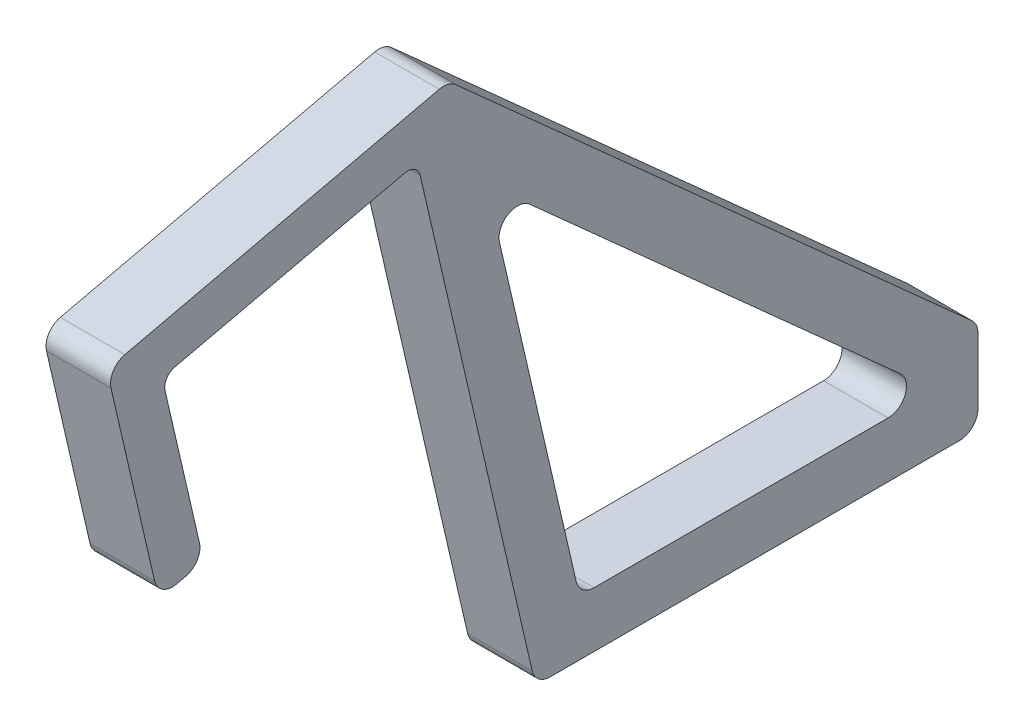
ISO-10303-21;
HEADER;
FILE_DESCRIPTION(('STEP AP214'),'2;1');
FILE_NAME('part.step','',(''),(''),'','','');
FILE_SCHEMA(('AUTOMOTIVE_DESIGN { 1 0 10303 214 1 1 1 1 }'));
ENDSEC;
DATA;
#1=APPLICATION_CONTEXT('core data for automotive mechanical design processes');
#2=APPLICATION_PROTOCOL_DEFINITION('international standard','automotive_design',2000,#1);
#3=PRODUCT_CONTEXT('',#1,'mechanical');
#4=PRODUCT('Part','Part','',(#3));
#5=PRODUCT_RELATED_PRODUCT_CATEGORY('part','',(#4));
#6=PRODUCT_DEFINITION_FORMATION('','',#4);
#7=PRODUCT_DEFINITION_CONTEXT('part definition',#1,'design');
#8=PRODUCT_DEFINITION('design','',#6,#7);
#9=PRODUCT_DEFINITION_SHAPE('','',#8);
#10=(LENGTH_UNIT() NAMED_UNIT(*) SI_UNIT(.MILLI.,.METRE.));
#11=(NAMED_UNIT(*) PLANE_ANGLE_UNIT() SI_UNIT($,.RADIAN.));
#12=(NAMED_UNIT(*) SI_UNIT($,.STERADIAN.) SOLID_ANGLE_UNIT());
#13=UNCERTAINTY_MEASURE_WITH_UNIT(LENGTH_MEASURE(1.E-05),#10,'distance_accuracy_value','');
#14=(GEOMETRIC_REPRESENTATION_CONTEXT(3) GLOBAL_UNCERTAINTY_ASSIGNED_CONTEXT((#13)) GLOBAL_UNIT_ASSIGNED_CONTEXT((#10,
#11,#12)) REPRESENTATION_CONTEXT('',''));
#15=CARTESIAN_POINT('',(0.,0.,0.));
#16=DIRECTION('',(0.,0.,1.));
#17=DIRECTION('',(1.,0.,0.));
#18=AXIS2_PLACEMENT_3D('',#15,#16,#17);
#19=CARTESIAN_POINT('',(4.445,0.,0.));
#20=DIRECTION('',(0.,0.224951054343865,-0.974370064785235));
#21=DIRECTION('',(0.,0.974370064785235,0.224951054343865));
#22=AXIS2_PLACEMENT_3D('',#19,#20,#21);
#23=PLANE('',#22);
#24=DIRECTION('',(0.,-0.974370064785235,-0.224951054343865));
#25=VECTOR('',#24,1.);
#26=CARTESIAN_POINT('',(0.,0.,0.));
#27=LINE('',#26,#25);
#28=CARTESIAN_POINT('',(0.,34.4011095073075,7.94212192466451));
#29=VERTEX_POINT('',#28);
#30=CARTESIAN_POINT('',(0.,0.984312160983291,0.227246368109107));
#31=VERTEX_POINT('',#30);
#32=EDGE_CURVE('E225',#29,#31,#27,.T.);
#33=ORIENTED_EDGE('',*,*,#32,.T.);
#34=DIRECTION('',(-1.,0.,0.));
#35=VECTOR('',#34,1.);
#36=CARTESIAN_POINT('',(4.445,0.984312160983291,0.227246368109107));
#37=LINE('',#36,#35);
#38=CARTESIAN_POINT('',(4.445,0.984312160983291,0.227246368109107));
#39=VERTEX_POINT('',#38);
#40=EDGE_CURVE('E361',#31,#39,#37,.F.);
#41=ORIENTED_EDGE('',*,*,#40,.T.);
#42=DIRECTION('',(0.,-0.974370064785235,-0.224951054343865));
#43=VECTOR('',#42,1.);
#44=CARTESIAN_POINT('',(4.445,0.,0.));
#45=LINE('',#44,#43);
#46=CARTESIAN_POINT('',(4.445,34.4011095073075,7.94212192466451));
#47=VERTEX_POINT('',#46);
#48=EDGE_CURVE('E228',#47,#39,#45,.T.);
#49=ORIENTED_EDGE('',*,*,#48,.F.);
#50=DIRECTION('',(-1.,0.,0.));
#51=VECTOR('',#50,1.);
#52=CARTESIAN_POINT('',(4.445,34.4011095073075,7.94212192466451));
#53=LINE('',#52,#51);
#54=EDGE_CURVE('E212',#47,#29,#53,.T.);
#55=ORIENTED_EDGE('',*,*,#54,.T.);
#56=EDGE_LOOP('',(#33,#41,#49,#55));
#57=FACE_BOUND('',#56,.T.);
#58=ADVANCED_FACE('F45',(#57),#23,.F.);
#59=CARTESIAN_POINT('',(4.445,0.,0.));
#60=DIRECTION('',(0.,1.,0.));
#61=DIRECTION('',(0.,0.,1.));
#62=AXIS2_PLACEMENT_3D('',#59,#60,#61);
#63=PLANE('',#62);
#64=DIRECTION('',(0.,0.,-1.));
#65=VECTOR('',#64,1.);
#66=CARTESIAN_POINT('',(0.,0.,0.));
#67=LINE('',#66,#65);
#68=CARTESIAN_POINT('',(0.,0.,-1.01020361416814));
#69=VERTEX_POINT('',#68);
#70=CARTESIAN_POINT('',(0.,0.,-29.21));
#71=VERTEX_POINT('',#70);
#72=EDGE_CURVE('E238',#69,#71,#67,.T.);
#73=ORIENTED_EDGE('',*,*,#72,.T.);
#74=DIRECTION('',(-1.,0.,0.));
#75=VECTOR('',#74,1.);
#76=CARTESIAN_POINT('',(4.445,0.,-29.21));
#77=LINE('',#76,#75);
#78=CARTESIAN_POINT('',(4.445,0.,-29.21));
#79=VERTEX_POINT('',#78);
#80=EDGE_CURVE('E358',#71,#79,#77,.F.);
#81=ORIENTED_EDGE('',*,*,#80,.T.);
#82=DIRECTION('',(0.,0.,-1.));
#83=VECTOR('',#82,1.);
#84=CARTESIAN_POINT('',(4.445,0.,0.));
#85=LINE('',#84,#83);
#86=CARTESIAN_POINT('',(4.445,0.,-1.01020361416814));
#87=VERTEX_POINT('',#86);
#88=EDGE_CURVE('E466',#87,#79,#85,.T.);
#89=ORIENTED_EDGE('',*,*,#88,.F.);
#90=DIRECTION('',(-1.,0.,0.));
#91=VECTOR('',#90,1.);
#92=CARTESIAN_POINT('',(4.445,0.,-1.01020361416814));
#93=LINE('',#92,#91);
#94=EDGE_CURVE('E354',#87,#69,#93,.T.);
#95=ORIENTED_EDGE('',*,*,#94,.T.);
#96=EDGE_LOOP('',(#73,#81,#89,#95));
#97=FACE_BOUND('',#96,.T.);
#98=ADVANCED_FACE('F495',(#97),#63,.F.);
#99=CARTESIAN_POINT('',(4.445,0.,-30.48));
#100=DIRECTION('',(0.,0.,1.));
#101=DIRECTION('',(1.,0.,0.));
#102=AXIS2_PLACEMENT_3D('',#99,#100,#101);
#103=PLANE('',#102);
#104=DIRECTION('',(0.,1.,0.));
#105=VECTOR('',#104,1.);
#106=CARTESIAN_POINT('',(0.,0.,-30.48));
#107=LINE('',#106,#105);
#108=CARTESIAN_POINT('',(0.,1.27,-30.48));
#109=VERTEX_POINT('',#108);
#110=CARTESIAN_POINT('',(0.,5.78272380341727,-30.48));
#111=VERTEX_POINT('',#110);
#112=EDGE_CURVE('E244',#109,#111,#107,.T.);
#113=ORIENTED_EDGE('',*,*,#112,.T.);
#114=DIRECTION('',(-1.,0.,0.));
#115=VECTOR('',#114,1.);
#116=CARTESIAN_POINT('',(4.445,5.78272380341727,-30.48));
#117=LINE('',#116,#115);
#118=CARTESIAN_POINT('',(4.445,5.78272380341727,-30.48));
#119=VERTEX_POINT('',#118);
#120=EDGE_CURVE('E351',#111,#119,#117,.F.);
#121=ORIENTED_EDGE('',*,*,#120,.T.);
#122=DIRECTION('',(0.,1.,0.));
#123=VECTOR('',#122,1.);
#124=CARTESIAN_POINT('',(4.445,0.,-30.48));
#125=LINE('',#124,#123);
#126=CARTESIAN_POINT('',(4.445,1.27,-30.48));
#127=VERTEX_POINT('',#126);
#128=EDGE_CURVE('E469',#127,#119,#125,.T.);
#129=ORIENTED_EDGE('',*,*,#128,.F.);
#130=DIRECTION('',(-1.,0.,0.));
#131=VECTOR('',#130,1.);
#132=CARTESIAN_POINT('',(4.445,1.27,-30.48));
#133=LINE('',#132,#131);
#134=EDGE_CURVE('E347',#127,#109,#133,.T.);
#135=ORIENTED_EDGE('',*,*,#134,.T.);
#136=EDGE_LOOP('',(#113,#121,#129,#135));
#137=FACE_BOUND('',#136,.T.);
#138=ADVANCED_FACE('F488',(#137),#103,.F.);
#139=CARTESIAN_POINT('',(4.445,35.2673244949016,1.79210341197621));
#140=DIRECTION('',(0.,-0.744756209689243,0.667336637784343));
#141=DIRECTION('',(0.,-0.667336637784343,-0.744756209689244));
#142=AXIS2_PLACEMENT_3D('',#139,#140,#141);
#143=PLANE('',#142);
#144=DIRECTION('',(0.,0.667336637784343,0.744756209689243));
#145=VECTOR('',#144,1.);
#146=CARTESIAN_POINT('',(0.,35.2673244949016,1.79210341197621));
#147=LINE('',#146,#145);
#148=CARTESIAN_POINT('',(0.,6.72856418972262,-30.0575175299861));
#149=VERTEX_POINT('',#148);
#150=CARTESIAN_POINT('',(0.,38.58405947834,5.49362200836349));
#151=VERTEX_POINT('',#150);
#152=EDGE_CURVE('E254',#149,#151,#147,.T.);
#153=ORIENTED_EDGE('',*,*,#152,.T.);
#154=DIRECTION('',(1.,0.,0.));
#155=VECTOR('',#154,1.);
#156=CARTESIAN_POINT('',(4.445,38.58405947834,5.49362200836349));
#157=LINE('',#156,#155);
#158=CARTESIAN_POINT('',(4.445,38.58405947834,5.49362200836349));
#159=VERTEX_POINT('',#158);
#160=EDGE_CURVE('E343',#151,#159,#157,.T.);
#161=ORIENTED_EDGE('',*,*,#160,.T.);
#162=DIRECTION('',(0.,0.667336637784343,0.744756209689243));
#163=VECTOR('',#162,1.);
#164=CARTESIAN_POINT('',(4.445,35.2673244949016,1.79210341197621));
#165=LINE('',#164,#163);
#166=CARTESIAN_POINT('',(4.445,6.72856418972262,-30.0575175299861));
#167=VERTEX_POINT('',#166);
#168=EDGE_CURVE('E231',#167,#159,#165,.T.);
#169=ORIENTED_EDGE('',*,*,#168,.F.);
#170=DIRECTION('',(-1.,0.,0.));
#171=VECTOR('',#170,1.);
#172=CARTESIAN_POINT('',(4.445,6.72856418972261,-30.0575175299861));
#173=LINE('',#172,#171);
#174=EDGE_CURVE('E339',#167,#149,#173,.T.);
#175=ORIENTED_EDGE('',*,*,#174,.T.);
#176=EDGE_LOOP('',(#153,#161,#169,#175));
#177=FACE_BOUND('',#176,.T.);
#178=ADVANCED_FACE('F480',(#177),#143,.F.);
#179=CARTESIAN_POINT('',(4.445,0.,0.));
#180=DIRECTION('',(-1.,0.,0.));
#181=DIRECTION('',(0.,0.,1.));
#182=AXIS2_PLACEMENT_3D('',#179,#180,#181);
#183=PLANE('',#182);
#184=DIRECTION('',(0.,-0.974370064785235,-0.224951054343866));
#185=VECTOR('',#184,1.);
#186=CARTESIAN_POINT('',(4.445,31.5735990096687,3.37912103999328));
#187=LINE('',#186,#185);
#188=CARTESIAN_POINT('',(4.445,27.6653462555202,2.47682979618151));
#189=VERTEX_POINT('',#188);
#190=CARTESIAN_POINT('',(4.445,4.79431216098328,-2.80336447439532));
#191=VERTEX_POINT('',#190);
#192=EDGE_CURVE('E400',#189,#191,#187,.T.);
#193=ORIENTED_EDGE('',*,*,#192,.F.);
#194=CARTESIAN_POINT('',(4.445,27.9510340945369,1.23937981390427));
#195=DIRECTION('',(-1.,0.,0.));
#196=DIRECTION('',(0.,0.,1.));
#197=AXIS2_PLACEMENT_3D('',#194,#195,#196);
#198=CIRCLE('',#197,1.27);
#199=CARTESIAN_POINT('',(4.445,28.8968744808422,0.391862283918146));
#200=VERTEX_POINT('',#199);
#201=EDGE_CURVE('E390',#189,#200,#198,.T.);
#202=ORIENTED_EDGE('',*,*,#201,.T.);
#203=DIRECTION('',(0.,0.667336637784343,0.744756209689243));
#204=VECTOR('',#203,1.);
#205=CARTESIAN_POINT('',(4.445,3.81,-27.6054099973314));
#206=LINE('',#205,#204);
#207=CARTESIAN_POINT('',(4.445,6.02584038630534,-25.1325038298232));
#208=VERTEX_POINT('',#207);
#209=EDGE_CURVE('E408',#208,#200,#206,.T.);
#210=ORIENTED_EDGE('',*,*,#209,.F.);
#211=CARTESIAN_POINT('',(4.445,5.08,-24.2849862998371));
#212=DIRECTION('',(-1.,0.,0.));
#213=DIRECTION('',(0.,0.,1.));
#214=AXIS2_PLACEMENT_3D('',#211,#212,#213);
#215=CIRCLE('',#214,1.27);
#216=CARTESIAN_POINT('',(4.445,3.81,-24.2849862998371));
#217=VERTEX_POINT('',#216);
#218=EDGE_CURVE('E384',#208,#217,#215,.T.);
#219=ORIENTED_EDGE('',*,*,#218,.T.);
#220=DIRECTION('',(0.,0.,-1.));
#221=VECTOR('',#220,1.);
#222=CARTESIAN_POINT('',(4.445,3.81,-3.03061084250442));
#223=LINE('',#222,#221);
#224=CARTESIAN_POINT('',(4.445,3.81,-4.04081445667256));
#225=VERTEX_POINT('',#224);
#226=EDGE_CURVE('E402',#225,#217,#223,.T.);
#227=ORIENTED_EDGE('',*,*,#226,.F.);
#228=CARTESIAN_POINT('',(4.445,5.08,-4.04081445667256));
#229=DIRECTION('',(-1.,0.,0.));
#230=DIRECTION('',(0.,0.,1.));
#231=AXIS2_PLACEMENT_3D('',#228,#229,#230);
#232=CIRCLE('',#231,1.27);
#233=EDGE_CURVE('E54',#225,#191,#232,.T.);
#234=ORIENTED_EDGE('',*,*,#233,.T.);
#235=EDGE_LOOP('',(#193,#202,#210,#219,#227,#234));
#236=FACE_BOUND('',#235,.T.);
#237=DIRECTION('',(0.,0.224951054343865,-0.974370064785235));
#238=VECTOR('',#237,1.);
#239=CARTESIAN_POINT('',(4.445,18.8360573580918,22.857014770146));
#240=LINE('',#239,#238);
#241=CARTESIAN_POINT('',(4.445,18.4075255995668,24.7131897435619));
#242=VERTEX_POINT('',#241);
#243=CARTESIAN_POINT('',(4.445,18.5503695190751,24.0944647524233));
#244=VERTEX_POINT('',#243);
#245=EDGE_CURVE('E444',#242,#244,#240,.T.);
#246=ORIENTED_EDGE('',*,*,#245,.T.);
#247=CARTESIAN_POINT('',(4.445,19.7878195013524,24.38015259144));
#248=DIRECTION('',(-1.,0.,0.));
#249=DIRECTION('',(0.,0.,1.));
#250=AXIS2_PLACEMENT_3D('',#247,#248,#249);
#251=CIRCLE('',#250,1.27);
#252=CARTESIAN_POINT('',(4.445,20.0735073403691,23.1427026091627));
#253=VERTEX_POINT('',#252);
#254=EDGE_CURVE('E299',#244,#253,#251,.F.);
#255=ORIENTED_EDGE('',*,*,#254,.T.);
#256=DIRECTION('',(0.,0.974370064785235,0.224951054343866));
#257=VECTOR('',#256,1.);
#258=CARTESIAN_POINT('',(4.445,31.2105571808643,25.7138931603131));
#259=LINE('',#258,#257);
#260=CARTESIAN_POINT('',(4.445,30.3443421932702,25.5139116730014));
#261=VERTEX_POINT('',#260);
#262=EDGE_CURVE('E441',#253,#261,#259,.T.);
#263=ORIENTED_EDGE('',*,*,#262,.T.);
#264=CARTESIAN_POINT('',(4.445,30.5443236805819,24.6476966854074));
#265=DIRECTION('',(-1.,0.,0.));
#266=DIRECTION('',(0.,0.,1.));
#267=AXIS2_PLACEMENT_3D('',#264,#265,#266);
#268=CIRCLE('',#267,0.889);
#269=CARTESIAN_POINT('',(4.445,31.410538668176,24.8476781727191));
#270=VERTEX_POINT('',#269);
#271=EDGE_CURVE('E267',#261,#270,#268,.T.);
#272=ORIENTED_EDGE('',*,*,#271,.T.);
#273=DIRECTION('',(0.,0.224951054343865,-0.974370064785235));
#274=VECTOR('',#273,1.);
#275=CARTESIAN_POINT('',(4.445,35.2673244949016,8.14210341197621));
#276=LINE('',#275,#274);
#277=CARTESIAN_POINT('',(4.445,35.0673430075899,9.00831839957028));
#278=VERTEX_POINT('',#277);
#279=EDGE_CURVE('E436',#270,#278,#276,.T.);
#280=ORIENTED_EDGE('',*,*,#279,.T.);
#281=CARTESIAN_POINT('',(4.445,34.2011280199958,8.80833691225859));
#282=DIRECTION('',(-1.,0.,0.));
#283=DIRECTION('',(0.,0.,1.));
#284=AXIS2_PLACEMENT_3D('',#281,#282,#283);
#285=CIRCLE('',#284,0.889);
#286=EDGE_CURVE('E219',#278,#47,#285,.T.);
#287=ORIENTED_EDGE('',*,*,#286,.T.);
#288=ORIENTED_EDGE('',*,*,#48,.T.);
#289=CARTESIAN_POINT('',(4.445,1.27,-1.01020361416814));
#290=DIRECTION('',(-1.,0.,0.));
#291=DIRECTION('',(0.,0.,1.));
#292=AXIS2_PLACEMENT_3D('',#289,#290,#291);
#293=CIRCLE('',#292,1.27);
#294=EDGE_CURVE('E281',#39,#87,#293,.F.);
#295=ORIENTED_EDGE('',*,*,#294,.T.);
#296=ORIENTED_EDGE('',*,*,#88,.T.);
#297=CARTESIAN_POINT('',(4.445,1.27,-29.21));
#298=DIRECTION('',(-1.,0.,0.));
#299=DIRECTION('',(0.,0.,1.));
#300=AXIS2_PLACEMENT_3D('',#297,#298,#299);
#301=CIRCLE('',#300,1.27);
#302=EDGE_CURVE('E284',#79,#127,#301,.F.);
#303=ORIENTED_EDGE('',*,*,#302,.T.);
#304=ORIENTED_EDGE('',*,*,#128,.T.);
#305=CARTESIAN_POINT('',(4.445,5.78272380341727,-29.21));
#306=DIRECTION('',(-1.,0.,0.));
#307=DIRECTION('',(0.,0.,1.));
#308=AXIS2_PLACEMENT_3D('',#305,#306,#307);
#309=CIRCLE('',#308,1.27);
#310=EDGE_CURVE('E287',#119,#167,#309,.F.);
#311=ORIENTED_EDGE('',*,*,#310,.T.);
#312=ORIENTED_EDGE('',*,*,#168,.T.);
#313=CARTESIAN_POINT('',(4.445,37.6382190920347,6.34113953834961));
#314=DIRECTION('',(-1.,0.,0.));
#315=DIRECTION('',(0.,0.,1.));
#316=AXIS2_PLACEMENT_3D('',#313,#314,#315);
#317=CIRCLE('',#316,1.27);
#318=CARTESIAN_POINT('',(4.445,38.8756690743119,6.62682737736631));
#319=VERTEX_POINT('',#318);
#320=EDGE_CURVE('E290',#159,#319,#317,.F.);
#321=ORIENTED_EDGE('',*,*,#320,.T.);
#322=DIRECTION('',(0.,-0.224951054343866,0.974370064785235));
#323=VECTOR('',#322,1.);
#324=CARTESIAN_POINT('',(4.445,33.5899625390157,29.521737713548));
#325=LINE('',#324,#323);
#326=CARTESIAN_POINT('',(4.445,33.8756503780324,28.2842877312708));
#327=VERTEX_POINT('',#326);
#328=EDGE_CURVE('E420',#319,#327,#325,.T.);
#329=ORIENTED_EDGE('',*,*,#328,.T.);
#330=CARTESIAN_POINT('',(4.445,32.6382003957551,27.9985998922541));
#331=DIRECTION('',(-1.,0.,0.));
#332=DIRECTION('',(0.,0.,1.));
#333=AXIS2_PLACEMENT_3D('',#330,#331,#332);
#334=CIRCLE('',#333,1.27);
#335=CARTESIAN_POINT('',(4.445,32.3525125567384,29.2360498745313));
#336=VERTEX_POINT('',#335);
#337=EDGE_CURVE('E293',#327,#336,#334,.F.);
#338=ORIENTED_EDGE('',*,*,#337,.T.);
#339=DIRECTION('',(0.,-0.974370064785235,-0.224951054343866));
#340=VECTOR('',#339,1.);
#341=CARTESIAN_POINT('',(4.445,18.1218377605501,25.9506397258392));
#342=LINE('',#341,#340);
#343=CARTESIAN_POINT('',(4.445,19.3592877428273,26.2363275648559));
#344=VERTEX_POINT('',#343);
#345=EDGE_CURVE('E425',#336,#344,#342,.T.);
#346=ORIENTED_EDGE('',*,*,#345,.T.);
#347=CARTESIAN_POINT('',(4.445,19.644975581844,24.9988775825786));
#348=DIRECTION('',(-1.,0.,0.));
#349=DIRECTION('',(0.,0.,1.));
#350=AXIS2_PLACEMENT_3D('',#347,#348,#349);
#351=CIRCLE('',#350,1.27);
#352=EDGE_CURVE('E296',#344,#242,#351,.F.);
#353=ORIENTED_EDGE('',*,*,#352,.T.);
#354=EDGE_LOOP('',(#246,#255,#263,#272,#280,#287,#288,#295,#296,#303,#304,#311,#312,#321,#329,
#338,#346,#353));
#355=FACE_BOUND('',#354,.T.);
#356=ADVANCED_FACE('F398',(#236,#355),#183,.F.);
#357=CARTESIAN_POINT('',(0.,0.,0.));
#358=DIRECTION('',(-1.,0.,0.));
#359=DIRECTION('',(0.,0.,1.));
#360=AXIS2_PLACEMENT_3D('',#357,#358,#359);
#361=PLANE('',#360);
#362=DIRECTION('',(0.,0.,-1.));
#363=VECTOR('',#362,1.);
#364=CARTESIAN_POINT('',(0.,3.81,-3.03061084250442));
#365=LINE('',#364,#363);
#366=CARTESIAN_POINT('',(0.,3.81,-4.04081445667256));
#367=VERTEX_POINT('',#366);
#368=CARTESIAN_POINT('',(0.,3.81,-24.2849862998371));
#369=VERTEX_POINT('',#368);
#370=EDGE_CURVE('E413',#367,#369,#365,.T.);
#371=ORIENTED_EDGE('',*,*,#370,.T.);
#372=CARTESIAN_POINT('',(0.,5.08,-24.2849862998371));
#373=DIRECTION('',(-1.,0.,0.));
#374=DIRECTION('',(0.,0.,1.));
#375=AXIS2_PLACEMENT_3D('',#372,#373,#374);
#376=CIRCLE('',#375,1.27);
#377=CARTESIAN_POINT('',(0.,6.02584038630534,-25.1325038298232));
#378=VERTEX_POINT('',#377);
#379=EDGE_CURVE('E387',#369,#378,#376,.F.);
#380=ORIENTED_EDGE('',*,*,#379,.T.);
#381=DIRECTION('',(0.,0.667336637784343,0.744756209689243));
#382=VECTOR('',#381,1.);
#383=CARTESIAN_POINT('',(0.,3.81,-27.6054099973314));
#384=LINE('',#383,#382);
#385=CARTESIAN_POINT('',(0.,28.8968744808422,0.391862283918146));
#386=VERTEX_POINT('',#385);
#387=EDGE_CURVE('E427',#378,#386,#384,.T.);
#388=ORIENTED_EDGE('',*,*,#387,.T.);
#389=CARTESIAN_POINT('',(0.,27.9510340945369,1.23937981390427));
#390=DIRECTION('',(-1.,0.,0.));
#391=DIRECTION('',(0.,0.,1.));
#392=AXIS2_PLACEMENT_3D('',#389,#390,#391);
#393=CIRCLE('',#392,1.27);
#394=CARTESIAN_POINT('',(0.,27.6653462555202,2.47682979618151));
#395=VERTEX_POINT('',#394);
#396=EDGE_CURVE('E68',#386,#395,#393,.F.);
#397=ORIENTED_EDGE('',*,*,#396,.T.);
#398=DIRECTION('',(0.,-0.974370064785235,-0.224951054343866));
#399=VECTOR('',#398,1.);
#400=CARTESIAN_POINT('',(0.,31.5735990096687,3.37912103999328));
#401=LINE('',#400,#399);
#402=CARTESIAN_POINT('',(0.,4.79431216098328,-2.80336447439532));
#403=VERTEX_POINT('',#402);
#404=EDGE_CURVE('E415',#395,#403,#401,.T.);
#405=ORIENTED_EDGE('',*,*,#404,.T.);
#406=CARTESIAN_POINT('',(0.,5.08,-4.04081445667256));
#407=DIRECTION('',(-1.,0.,0.));
#408=DIRECTION('',(0.,0.,1.));
#409=AXIS2_PLACEMENT_3D('',#406,#407,#408);
#410=CIRCLE('',#409,1.27);
#411=EDGE_CURVE('E11',#403,#367,#410,.F.);
#412=ORIENTED_EDGE('',*,*,#411,.T.);
#413=EDGE_LOOP('',(#371,#380,#388,#397,#405,#412));
#414=FACE_BOUND('',#413,.T.);
#415=DIRECTION('',(0.,0.974370064785235,0.224951054343866));
#416=VECTOR('',#415,1.);
#417=CARTESIAN_POINT('',(0.,31.2105571808643,25.7138931603131));
#418=LINE('',#417,#416);
#419=CARTESIAN_POINT('',(0.,20.0735073403691,23.1427026091627));
#420=VERTEX_POINT('',#419);
#421=CARTESIAN_POINT('',(0.,30.3443421932702,25.5139116730014));
#422=VERTEX_POINT('',#421);
#423=EDGE_CURVE('E246',#420,#422,#418,.T.);
#424=ORIENTED_EDGE('',*,*,#423,.F.);
#425=CARTESIAN_POINT('',(0.,19.7878195013524,24.38015259144));
#426=DIRECTION('',(-1.,0.,0.));
#427=DIRECTION('',(0.,0.,1.));
#428=AXIS2_PLACEMENT_3D('',#425,#426,#427);
#429=CIRCLE('',#428,1.27);
#430=CARTESIAN_POINT('',(0.,18.5503695190751,24.0944647524233));
#431=VERTEX_POINT('',#430);
#432=EDGE_CURVE('E322',#420,#431,#429,.T.);
#433=ORIENTED_EDGE('',*,*,#432,.T.);
#434=DIRECTION('',(0.,0.224951054343865,-0.974370064785235));
#435=VECTOR('',#434,1.);
#436=CARTESIAN_POINT('',(0.,18.8360573580918,22.857014770146));
#437=LINE('',#436,#435);
#438=CARTESIAN_POINT('',(0.,18.4075255995668,24.7131897435619));
#439=VERTEX_POINT('',#438);
#440=EDGE_CURVE('E453',#439,#431,#437,.T.);
#441=ORIENTED_EDGE('',*,*,#440,.F.);
#442=CARTESIAN_POINT('',(0.,19.644975581844,24.9988775825786));
#443=DIRECTION('',(-1.,0.,0.));
#444=DIRECTION('',(0.,0.,1.));
#445=AXIS2_PLACEMENT_3D('',#442,#443,#444);
#446=CIRCLE('',#445,1.27);
#447=CARTESIAN_POINT('',(0.,19.3592877428273,26.2363275648559));
#448=VERTEX_POINT('',#447);
#449=EDGE_CURVE('E319',#439,#448,#446,.T.);
#450=ORIENTED_EDGE('',*,*,#449,.T.);
#451=DIRECTION('',(0.,-0.974370064785235,-0.224951054343866));
#452=VECTOR('',#451,1.);
#453=CARTESIAN_POINT('',(0.,18.1218377605501,25.9506397258392));
#454=LINE('',#453,#452);
#455=CARTESIAN_POINT('',(0.,32.3525125567384,29.2360498745313));
#456=VERTEX_POINT('',#455);
#457=EDGE_CURVE('E457',#456,#448,#454,.T.);
#458=ORIENTED_EDGE('',*,*,#457,.F.);
#459=CARTESIAN_POINT('',(0.,32.6382003957551,27.9985998922541));
#460=DIRECTION('',(-1.,0.,0.));
#461=DIRECTION('',(0.,0.,1.));
#462=AXIS2_PLACEMENT_3D('',#459,#460,#461);
#463=CIRCLE('',#462,1.27);
#464=CARTESIAN_POINT('',(0.,33.8756503780324,28.2842877312708));
#465=VERTEX_POINT('',#464);
#466=EDGE_CURVE('E316',#456,#465,#463,.T.);
#467=ORIENTED_EDGE('',*,*,#466,.T.);
#468=DIRECTION('',(0.,-0.224951054343866,0.974370064785235));
#469=VECTOR('',#468,1.);
#470=CARTESIAN_POINT('',(0.,33.5899625390157,29.521737713548));
#471=LINE('',#470,#469);
#472=CARTESIAN_POINT('',(0.,38.8756690743119,6.62682737736632));
#473=VERTEX_POINT('',#472);
#474=EDGE_CURVE('E440',#473,#465,#471,.T.);
#475=ORIENTED_EDGE('',*,*,#474,.F.);
#476=CARTESIAN_POINT('',(0.,37.6382190920347,6.34113953834961));
#477=DIRECTION('',(-1.,0.,0.));
#478=DIRECTION('',(0.,0.,1.));
#479=AXIS2_PLACEMENT_3D('',#476,#477,#478);
#480=CIRCLE('',#479,1.27);
#481=EDGE_CURVE('E313',#473,#151,#480,.T.);
#482=ORIENTED_EDGE('',*,*,#481,.T.);
#483=ORIENTED_EDGE('',*,*,#152,.F.);
#484=CARTESIAN_POINT('',(0.,5.78272380341727,-29.21));
#485=DIRECTION('',(-1.,0.,0.));
#486=DIRECTION('',(0.,0.,1.));
#487=AXIS2_PLACEMENT_3D('',#484,#485,#486);
#488=CIRCLE('',#487,1.27);
#489=EDGE_CURVE('E310',#149,#111,#488,.T.);
#490=ORIENTED_EDGE('',*,*,#489,.T.);
#491=ORIENTED_EDGE('',*,*,#112,.F.);
#492=CARTESIAN_POINT('',(0.,1.27,-29.21));
#493=DIRECTION('',(-1.,0.,0.));
#494=DIRECTION('',(0.,0.,1.));
#495=AXIS2_PLACEMENT_3D('',#492,#493,#494);
#496=CIRCLE('',#495,1.27);
#497=EDGE_CURVE('E307',#109,#71,#496,.T.);
#498=ORIENTED_EDGE('',*,*,#497,.T.);
#499=ORIENTED_EDGE('',*,*,#72,.F.);
#500=CARTESIAN_POINT('',(0.,1.27,-1.01020361416814));
#501=DIRECTION('',(-1.,0.,0.));
#502=DIRECTION('',(0.,0.,1.));
#503=AXIS2_PLACEMENT_3D('',#500,#501,#502);
#504=CIRCLE('',#503,1.27);
#505=EDGE_CURVE('E236',#69,#31,#504,.T.);
#506=ORIENTED_EDGE('',*,*,#505,.T.);
#507=ORIENTED_EDGE('',*,*,#32,.F.);
#508=CARTESIAN_POINT('',(0.,34.2011280199958,8.80833691225859));
#509=DIRECTION('',(-1.,0.,0.));
#510=DIRECTION('',(0.,0.,1.));
#511=AXIS2_PLACEMENT_3D('',#508,#509,#510);
#512=CIRCLE('',#511,0.889);
#513=CARTESIAN_POINT('',(0.,35.0673430075899,9.00831839957028));
#514=VERTEX_POINT('',#513);
#515=EDGE_CURVE('E208',#29,#514,#512,.F.);
#516=ORIENTED_EDGE('',*,*,#515,.T.);
#517=DIRECTION('',(0.,0.224951054343865,-0.974370064785235));
#518=VECTOR('',#517,1.);
#519=CARTESIAN_POINT('',(0.,35.2673244949016,8.14210341197621));
#520=LINE('',#519,#518);
#521=CARTESIAN_POINT('',(0.,31.410538668176,24.8476781727191));
#522=VERTEX_POINT('',#521);
#523=EDGE_CURVE('E239',#522,#514,#520,.T.);
#524=ORIENTED_EDGE('',*,*,#523,.F.);
#525=CARTESIAN_POINT('',(0.,30.5443236805819,24.6476966854074));
#526=DIRECTION('',(-1.,0.,0.));
#527=DIRECTION('',(0.,0.,1.));
#528=AXIS2_PLACEMENT_3D('',#525,#526,#527);
#529=CIRCLE('',#528,0.889);
#530=EDGE_CURVE('E270',#522,#422,#529,.F.);
#531=ORIENTED_EDGE('',*,*,#530,.T.);
#532=EDGE_LOOP('',(#424,#433,#441,#450,#458,#467,#475,#482,#483,#490,#491,#498,#499,#506,#507,
#516,#524,#531));
#533=FACE_BOUND('',#532,.T.);
#534=ADVANCED_FACE('F234',(#414,#533),#361,.T.);
#535=CARTESIAN_POINT('',(-34.7250769014315,33.5899625390157,29.521737713548));
#536=DIRECTION('',(0.,0.974370064785235,0.224951054343866));
#537=DIRECTION('',(0.,-0.224951054343866,0.974370064785235));
#538=AXIS2_PLACEMENT_3D('',#535,#536,#537);
#539=PLANE('',#538);
#540=ORIENTED_EDGE('',*,*,#474,.T.);
#541=DIRECTION('',(1.,0.,0.));
#542=VECTOR('',#541,1.);
#543=CARTESIAN_POINT('',(-34.7250769014315,33.8756503780324,28.2842877312708));
#544=LINE('',#543,#542);
#545=EDGE_CURVE('E335',#465,#327,#544,.T.);
#546=ORIENTED_EDGE('',*,*,#545,.T.);
#547=ORIENTED_EDGE('',*,*,#328,.F.);
#548=DIRECTION('',(1.,0.,0.));
#549=VECTOR('',#548,1.);
#550=CARTESIAN_POINT('',(0.,38.8756690743119,6.62682737736632));
#551=LINE('',#550,#549);
#552=EDGE_CURVE('E332',#319,#473,#551,.F.);
#553=ORIENTED_EDGE('',*,*,#552,.T.);
#554=EDGE_LOOP('',(#540,#546,#547,#553));
#555=FACE_BOUND('',#554,.T.);
#556=ADVANCED_FACE('F537',(#555),#539,.T.);
#557=CARTESIAN_POINT('',(-34.7250769014315,18.1218377605501,25.9506397258392));
#558=DIRECTION('',(0.,-0.224951054343866,0.974370064785235));
#559=DIRECTION('',(0.,-0.974370064785235,-0.224951054343866));
#560=AXIS2_PLACEMENT_3D('',#557,#558,#559);
#561=PLANE('',#560);
#562=ORIENTED_EDGE('',*,*,#457,.T.);
#563=DIRECTION('',(1.,0.,0.));
#564=VECTOR('',#563,1.);
#565=CARTESIAN_POINT('',(-34.7250769014315,19.3592877428273,26.2363275648559));
#566=LINE('',#565,#564);
#567=EDGE_CURVE('E328',#448,#344,#566,.T.);
#568=ORIENTED_EDGE('',*,*,#567,.T.);
#569=ORIENTED_EDGE('',*,*,#345,.F.);
#570=DIRECTION('',(1.,0.,0.));
#571=VECTOR('',#570,1.);
#572=CARTESIAN_POINT('',(-34.7250769014315,32.3525125567384,29.2360498745313));
#573=LINE('',#572,#571);
#574=EDGE_CURVE('E325',#336,#456,#573,.F.);
#575=ORIENTED_EDGE('',*,*,#574,.T.);
#576=EDGE_LOOP('',(#562,#568,#569,#575));
#577=FACE_BOUND('',#576,.T.);
#578=ADVANCED_FACE('F528',(#577),#561,.T.);
#579=CARTESIAN_POINT('',(-34.7250769014315,18.8360573580918,22.857014770146));
#580=DIRECTION('',(0.,-0.974370064785235,-0.224951054343865));
#581=DIRECTION('',(0.,0.224951054343865,-0.974370064785235));
#582=AXIS2_PLACEMENT_3D('',#579,#580,#581);
#583=PLANE('',#582);
#584=ORIENTED_EDGE('',*,*,#440,.T.);
#585=DIRECTION('',(1.,0.,0.));
#586=VECTOR('',#585,1.);
#587=CARTESIAN_POINT('',(-34.7250769014315,18.5503695190751,24.0944647524233));
#588=LINE('',#587,#586);
#589=EDGE_CURVE('E277',#431,#244,#588,.T.);
#590=ORIENTED_EDGE('',*,*,#589,.T.);
#591=ORIENTED_EDGE('',*,*,#245,.F.);
#592=DIRECTION('',(1.,0.,0.));
#593=VECTOR('',#592,1.);
#594=CARTESIAN_POINT('',(-34.7250769014315,18.4075255995668,24.7131897435619));
#595=LINE('',#594,#593);
#596=EDGE_CURVE('E274',#242,#439,#595,.F.);
#597=ORIENTED_EDGE('',*,*,#596,.T.);
#598=EDGE_LOOP('',(#584,#590,#591,#597));
#599=FACE_BOUND('',#598,.T.);
#600=ADVANCED_FACE('F519',(#599),#583,.T.);
#601=CARTESIAN_POINT('',(-34.7250769014315,31.2105571808643,25.7138931603131));
#602=DIRECTION('',(0.,0.224951054343866,-0.974370064785235));
#603=DIRECTION('',(0.,0.974370064785235,0.224951054343866));
#604=AXIS2_PLACEMENT_3D('',#601,#602,#603);
#605=PLANE('',#604);
#606=ORIENTED_EDGE('',*,*,#262,.F.);
#607=DIRECTION('',(1.,0.,0.));
#608=VECTOR('',#607,1.);
#609=CARTESIAN_POINT('',(-34.7250769014315,20.0735073403691,23.1427026091627));
#610=LINE('',#609,#608);
#611=EDGE_CURVE('E302',#253,#420,#610,.F.);
#612=ORIENTED_EDGE('',*,*,#611,.T.);
#613=ORIENTED_EDGE('',*,*,#423,.T.);
#614=DIRECTION('',(1.,0.,0.));
#615=VECTOR('',#614,1.);
#616=CARTESIAN_POINT('',(4.445,30.3443421932702,25.5139116730014));
#617=LINE('',#616,#615);
#618=EDGE_CURVE('E220',#422,#261,#617,.T.);
#619=ORIENTED_EDGE('',*,*,#618,.T.);
#620=EDGE_LOOP('',(#606,#612,#613,#619));
#621=FACE_BOUND('',#620,.T.);
#622=ADVANCED_FACE('F667',(#621),#605,.T.);
#623=CARTESIAN_POINT('',(-34.7250769014315,35.2673244949016,8.14210341197621));
#624=DIRECTION('',(0.,-0.974370064785235,-0.224951054343865));
#625=DIRECTION('',(0.,0.224951054343865,-0.974370064785235));
#626=AXIS2_PLACEMENT_3D('',#623,#624,#625);
#627=PLANE('',#626);
#628=ORIENTED_EDGE('',*,*,#523,.T.);
#629=DIRECTION('',(-1.,0.,0.));
#630=VECTOR('',#629,1.);
#631=CARTESIAN_POINT('',(-34.7250769014315,35.0673430075899,9.00831839957028));
#632=LINE('',#631,#630);
#633=EDGE_CURVE('E213',#514,#278,#632,.F.);
#634=ORIENTED_EDGE('',*,*,#633,.T.);
#635=ORIENTED_EDGE('',*,*,#279,.F.);
#636=DIRECTION('',(1.,0.,0.));
#637=VECTOR('',#636,1.);
#638=CARTESIAN_POINT('',(0.,31.410538668176,24.8476781727191));
#639=LINE('',#638,#637);
#640=EDGE_CURVE('E230',#270,#522,#639,.F.);
#641=ORIENTED_EDGE('',*,*,#640,.T.);
#642=EDGE_LOOP('',(#628,#634,#635,#641));
#643=FACE_BOUND('',#642,.T.);
#644=ADVANCED_FACE('F505',(#643),#627,.T.);
#645=CARTESIAN_POINT('',(4.445,34.2011280199958,8.80833691225859));
#646=DIRECTION('',(-1.,0.,0.));
#647=DIRECTION('',(0.,0.,1.));
#648=AXIS2_PLACEMENT_3D('',#645,#646,#647);
#649=CYLINDRICAL_SURFACE('',#648,0.889);
#650=ORIENTED_EDGE('',*,*,#286,.F.);
#651=ORIENTED_EDGE('',*,*,#633,.F.);
#652=ORIENTED_EDGE('',*,*,#515,.F.);
#653=ORIENTED_EDGE('',*,*,#54,.F.);
#654=EDGE_LOOP('',(#650,#651,#652,#653));
#655=FACE_BOUND('',#654,.T.);
#656=ADVANCED_FACE('F211',(#655),#649,.F.);
#657=CARTESIAN_POINT('',(-34.7250769014315,30.5443236805819,24.6476966854074));
#658=DIRECTION('',(-1.,0.,0.));
#659=DIRECTION('',(0.,0.,1.));
#660=AXIS2_PLACEMENT_3D('',#657,#658,#659);
#661=CYLINDRICAL_SURFACE('',#660,0.889);
#662=ORIENTED_EDGE('',*,*,#530,.F.);
#663=ORIENTED_EDGE('',*,*,#640,.F.);
#664=ORIENTED_EDGE('',*,*,#271,.F.);
#665=ORIENTED_EDGE('',*,*,#618,.F.);
#666=EDGE_LOOP('',(#662,#663,#664,#665));
#667=FACE_BOUND('',#666,.T.);
#668=ADVANCED_FACE('F508',(#667),#661,.F.);
#669=CARTESIAN_POINT('',(-34.7250769014315,19.7878195013524,24.38015259144));
#670=DIRECTION('',(1.,0.,0.));
#671=DIRECTION('',(0.,0.,-1.));
#672=AXIS2_PLACEMENT_3D('',#669,#670,#671);
#673=CYLINDRICAL_SURFACE('',#672,1.27);
#674=ORIENTED_EDGE('',*,*,#432,.F.);
#675=ORIENTED_EDGE('',*,*,#611,.F.);
#676=ORIENTED_EDGE('',*,*,#254,.F.);
#677=ORIENTED_EDGE('',*,*,#589,.F.);
#678=EDGE_LOOP('',(#674,#675,#676,#677));
#679=FACE_BOUND('',#678,.T.);
#680=ADVANCED_FACE('F516',(#679),#673,.T.);
#681=CARTESIAN_POINT('',(-34.7250769014315,19.644975581844,24.9988775825786));
#682=DIRECTION('',(1.,0.,0.));
#683=DIRECTION('',(0.,0.,-1.));
#684=AXIS2_PLACEMENT_3D('',#681,#682,#683);
#685=CYLINDRICAL_SURFACE('',#684,1.27);
#686=ORIENTED_EDGE('',*,*,#449,.F.);
#687=ORIENTED_EDGE('',*,*,#596,.F.);
#688=ORIENTED_EDGE('',*,*,#352,.F.);
#689=ORIENTED_EDGE('',*,*,#567,.F.);
#690=EDGE_LOOP('',(#686,#687,#688,#689));
#691=FACE_BOUND('',#690,.T.);
#692=ADVANCED_FACE('F526',(#691),#685,.T.);
#693=CARTESIAN_POINT('',(-34.7250769014315,32.6382003957551,27.9985998922541));
#694=DIRECTION('',(1.,0.,0.));
#695=DIRECTION('',(0.,0.,-1.));
#696=AXIS2_PLACEMENT_3D('',#693,#694,#695);
#697=CYLINDRICAL_SURFACE('',#696,1.27);
#698=ORIENTED_EDGE('',*,*,#466,.F.);
#699=ORIENTED_EDGE('',*,*,#574,.F.);
#700=ORIENTED_EDGE('',*,*,#337,.F.);
#701=ORIENTED_EDGE('',*,*,#545,.F.);
#702=EDGE_LOOP('',(#698,#699,#700,#701));
#703=FACE_BOUND('',#702,.T.);
#704=ADVANCED_FACE('F535',(#703),#697,.T.);
#705=CARTESIAN_POINT('',(4.445,37.6382190920347,6.34113953834961));
#706=DIRECTION('',(-1.,0.,0.));
#707=DIRECTION('',(0.,0.,1.));
#708=AXIS2_PLACEMENT_3D('',#705,#706,#707);
#709=CYLINDRICAL_SURFACE('',#708,1.27);
#710=ORIENTED_EDGE('',*,*,#481,.F.);
#711=ORIENTED_EDGE('',*,*,#552,.F.);
#712=ORIENTED_EDGE('',*,*,#320,.F.);
#713=ORIENTED_EDGE('',*,*,#160,.F.);
#714=EDGE_LOOP('',(#710,#711,#712,#713));
#715=FACE_BOUND('',#714,.T.);
#716=ADVANCED_FACE('F541',(#715),#709,.T.);
#717=CARTESIAN_POINT('',(4.445,5.78272380341727,-29.21));
#718=DIRECTION('',(-1.,0.,0.));
#719=DIRECTION('',(0.,0.,1.));
#720=AXIS2_PLACEMENT_3D('',#717,#718,#719);
#721=CYLINDRICAL_SURFACE('',#720,1.27);
#722=ORIENTED_EDGE('',*,*,#310,.F.);
#723=ORIENTED_EDGE('',*,*,#120,.F.);
#724=ORIENTED_EDGE('',*,*,#489,.F.);
#725=ORIENTED_EDGE('',*,*,#174,.F.);
#726=EDGE_LOOP('',(#722,#723,#724,#725));
#727=FACE_BOUND('',#726,.T.);
#728=ADVANCED_FACE('F484',(#727),#721,.T.);
#729=CARTESIAN_POINT('',(4.445,1.27,-29.21));
#730=DIRECTION('',(-1.,0.,0.));
#731=DIRECTION('',(0.,0.,1.));
#732=AXIS2_PLACEMENT_3D('',#729,#730,#731);
#733=CYLINDRICAL_SURFACE('',#732,1.27);
#734=ORIENTED_EDGE('',*,*,#302,.F.);
#735=ORIENTED_EDGE('',*,*,#80,.F.);
#736=ORIENTED_EDGE('',*,*,#497,.F.);
#737=ORIENTED_EDGE('',*,*,#134,.F.);
#738=EDGE_LOOP('',(#734,#735,#736,#737));
#739=FACE_BOUND('',#738,.T.);
#740=ADVANCED_FACE('F492',(#739),#733,.T.);
#741=CARTESIAN_POINT('',(4.445,1.27,-1.01020361416814));
#742=DIRECTION('',(-1.,0.,0.));
#743=DIRECTION('',(0.,0.,1.));
#744=AXIS2_PLACEMENT_3D('',#741,#742,#743);
#745=CYLINDRICAL_SURFACE('',#744,1.27);
#746=ORIENTED_EDGE('',*,*,#294,.F.);
#747=ORIENTED_EDGE('',*,*,#40,.F.);
#748=ORIENTED_EDGE('',*,*,#505,.F.);
#749=ORIENTED_EDGE('',*,*,#94,.F.);
#750=EDGE_LOOP('',(#746,#747,#748,#749));
#751=FACE_BOUND('',#750,.T.);
#752=ADVANCED_FACE('F500',(#751),#745,.T.);
#753=CARTESIAN_POINT('',(0.,3.81,-27.6054099973314));
#754=DIRECTION('',(0.,0.744756209689243,-0.667336637784343));
#755=DIRECTION('',(0.,0.667336637784343,0.744756209689244));
#756=AXIS2_PLACEMENT_3D('',#753,#754,#755);
#757=PLANE('',#756);
#758=ORIENTED_EDGE('',*,*,#387,.F.);
#759=DIRECTION('',(1.,0.,0.));
#760=VECTOR('',#759,1.);
#761=CARTESIAN_POINT('',(4.445,6.02584038630534,-25.1325038298232));
#762=LINE('',#761,#760);
#763=EDGE_CURVE('E367',#378,#208,#762,.T.);
#764=ORIENTED_EDGE('',*,*,#763,.T.);
#765=ORIENTED_EDGE('',*,*,#209,.T.);
#766=DIRECTION('',(1.,0.,0.));
#767=VECTOR('',#766,1.);
#768=CARTESIAN_POINT('',(0.,28.8968744808423,0.39186228391815));
#769=LINE('',#768,#767);
#770=EDGE_CURVE('E364',#200,#386,#769,.F.);
#771=ORIENTED_EDGE('',*,*,#770,.T.);
#772=EDGE_LOOP('',(#758,#764,#765,#771));
#773=FACE_BOUND('',#772,.T.);
#774=ADVANCED_FACE('F603',(#773),#757,.F.);
#775=CARTESIAN_POINT('',(0.,3.81,-3.03061084250442));
#776=DIRECTION('',(0.,-1.,0.));
#777=DIRECTION('',(0.,0.,-1.));
#778=AXIS2_PLACEMENT_3D('',#775,#776,#777);
#779=PLANE('',#778);
#780=ORIENTED_EDGE('',*,*,#226,.T.);
#781=DIRECTION('',(1.,0.,0.));
#782=VECTOR('',#781,1.);
#783=CARTESIAN_POINT('',(0.,3.81,-24.2849862998371));
#784=LINE('',#783,#782);
#785=EDGE_CURVE('E375',#217,#369,#784,.F.);
#786=ORIENTED_EDGE('',*,*,#785,.T.);
#787=ORIENTED_EDGE('',*,*,#370,.F.);
#788=DIRECTION('',(1.,0.,0.));
#789=VECTOR('',#788,1.);
#790=CARTESIAN_POINT('',(4.445,3.81,-4.04081445667256));
#791=LINE('',#790,#789);
#792=EDGE_CURVE('E371',#367,#225,#791,.T.);
#793=ORIENTED_EDGE('',*,*,#792,.T.);
#794=EDGE_LOOP('',(#780,#786,#787,#793));
#795=FACE_BOUND('',#794,.T.);
#796=ADVANCED_FACE('F417',(#795),#779,.F.);
#797=CARTESIAN_POINT('',(0.,31.5735990096687,3.37912103999328));
#798=DIRECTION('',(0.,-0.224951054343865,0.974370064785235));
#799=DIRECTION('',(0.,-0.974370064785235,-0.224951054343866));
#800=AXIS2_PLACEMENT_3D('',#797,#798,#799);
#801=PLANE('',#800);
#802=ORIENTED_EDGE('',*,*,#404,.F.);
#803=DIRECTION('',(1.,0.,0.));
#804=VECTOR('',#803,1.);
#805=CARTESIAN_POINT('',(4.445,27.6653462555202,2.47682979618151));
#806=LINE('',#805,#804);
#807=EDGE_CURVE('E380',#395,#189,#806,.T.);
#808=ORIENTED_EDGE('',*,*,#807,.T.);
#809=ORIENTED_EDGE('',*,*,#192,.T.);
#810=DIRECTION('',(1.,0.,0.));
#811=VECTOR('',#810,1.);
#812=CARTESIAN_POINT('',(0.,4.79431216098329,-2.80336447439532));
#813=LINE('',#812,#811);
#814=EDGE_CURVE('E61',#191,#403,#813,.F.);
#815=ORIENTED_EDGE('',*,*,#814,.T.);
#816=EDGE_LOOP('',(#802,#808,#809,#815));
#817=FACE_BOUND('',#816,.T.);
#818=ADVANCED_FACE('F405',(#817),#801,.F.);
#819=CARTESIAN_POINT('',(0.,5.08,-24.2849862998371));
#820=DIRECTION('',(-1.,0.,0.));
#821=DIRECTION('',(0.,0.,1.));
#822=AXIS2_PLACEMENT_3D('',#819,#820,#821);
#823=CYLINDRICAL_SURFACE('',#822,1.27);
#824=ORIENTED_EDGE('',*,*,#379,.F.);
#825=ORIENTED_EDGE('',*,*,#785,.F.);
#826=ORIENTED_EDGE('',*,*,#218,.F.);
#827=ORIENTED_EDGE('',*,*,#763,.F.);
#828=EDGE_LOOP('',(#824,#825,#826,#827));
#829=FACE_BOUND('',#828,.T.);
#830=ADVANCED_FACE('F631',(#829),#823,.F.);
#831=CARTESIAN_POINT('',(0.,27.9510340945369,1.23937981390427));
#832=DIRECTION('',(-1.,0.,0.));
#833=DIRECTION('',(0.,0.,1.));
#834=AXIS2_PLACEMENT_3D('',#831,#832,#833);
#835=CYLINDRICAL_SURFACE('',#834,1.27);
#836=ORIENTED_EDGE('',*,*,#396,.F.);
#837=ORIENTED_EDGE('',*,*,#770,.F.);
#838=ORIENTED_EDGE('',*,*,#201,.F.);
#839=ORIENTED_EDGE('',*,*,#807,.F.);
#840=EDGE_LOOP('',(#836,#837,#838,#839));
#841=FACE_BOUND('',#840,.T.);
#842=ADVANCED_FACE('F640',(#841),#835,.F.);
#843=CARTESIAN_POINT('',(0.,5.08,-4.04081445667256));
#844=DIRECTION('',(-1.,0.,0.));
#845=DIRECTION('',(0.,0.,1.));
#846=AXIS2_PLACEMENT_3D('',#843,#844,#845);
#847=CYLINDRICAL_SURFACE('',#846,1.27);
#848=ORIENTED_EDGE('',*,*,#411,.F.);
#849=ORIENTED_EDGE('',*,*,#814,.F.);
#850=ORIENTED_EDGE('',*,*,#233,.F.);
#851=ORIENTED_EDGE('',*,*,#792,.F.);
#852=EDGE_LOOP('',(#848,#849,#850,#851));
#853=FACE_BOUND('',#852,.T.);
#854=ADVANCED_FACE('F47',(#853),#847,.F.);
#855=CLOSED_SHELL('',(#58,#98,#138,#178,#356,#534,#556,#578,#600,#622,#644,#656,#668,#680,#692,
#704,#716,#728,#740,#752,#774,#796,#818,#830,#842,#854));
#856=MANIFOLD_SOLID_BREP('B2',#855);
#857=ADVANCED_BREP_SHAPE_REPRESENTATION('',(#18,#856),#14);
#858=SHAPE_DEFINITION_REPRESENTATION(#9,#857);
ENDSEC;
END-ISO-10303-21;
